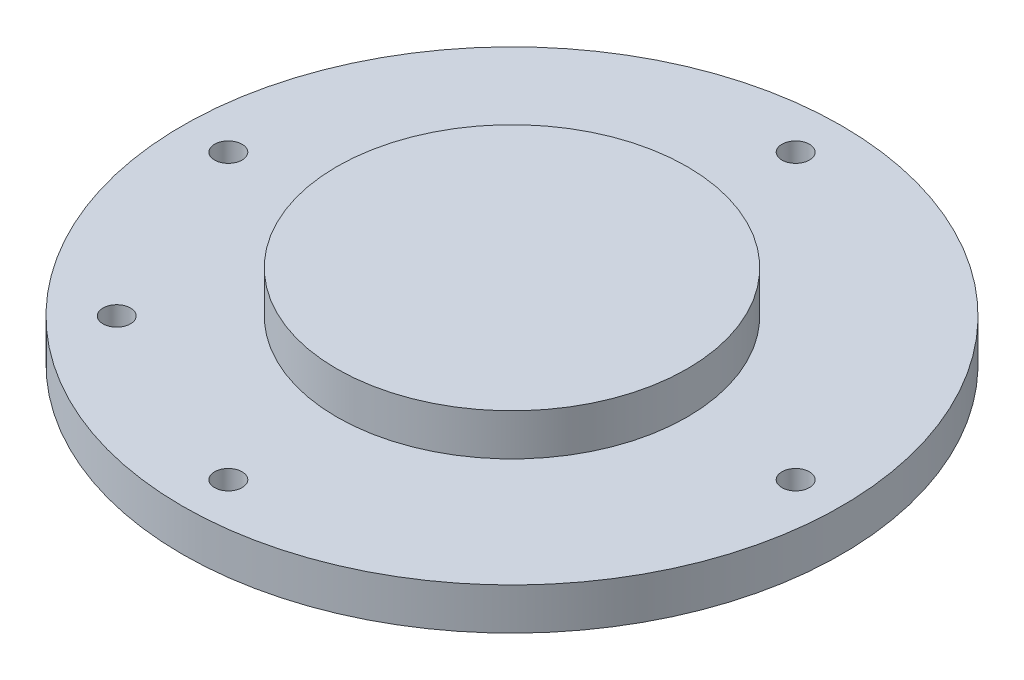
ISO-10303-21;
HEADER;
FILE_DESCRIPTION(('STEP AP214'),'2;1');
FILE_NAME('part.step','',(''),(''),'','','');
FILE_SCHEMA(('AUTOMOTIVE_DESIGN { 1 0 10303 214 1 1 1 1 }'));
ENDSEC;
DATA;
#1=APPLICATION_CONTEXT('core data for automotive mechanical design processes');
#2=APPLICATION_PROTOCOL_DEFINITION('international standard','automotive_design',2000,#1);
#3=PRODUCT_CONTEXT('',#1,'mechanical');
#4=PRODUCT('Part','Part','',(#3));
#5=PRODUCT_RELATED_PRODUCT_CATEGORY('part','',(#4));
#6=PRODUCT_DEFINITION_FORMATION('','',#4);
#7=PRODUCT_DEFINITION_CONTEXT('part definition',#1,'design');
#8=PRODUCT_DEFINITION('design','',#6,#7);
#9=PRODUCT_DEFINITION_SHAPE('','',#8);
#10=(LENGTH_UNIT() NAMED_UNIT(*) SI_UNIT(.MILLI.,.METRE.));
#11=(NAMED_UNIT(*) PLANE_ANGLE_UNIT() SI_UNIT($,.RADIAN.));
#12=(NAMED_UNIT(*) SI_UNIT($,.STERADIAN.) SOLID_ANGLE_UNIT());
#13=UNCERTAINTY_MEASURE_WITH_UNIT(LENGTH_MEASURE(1.E-05),#10,'distance_accuracy_value','');
#14=(GEOMETRIC_REPRESENTATION_CONTEXT(3) GLOBAL_UNCERTAINTY_ASSIGNED_CONTEXT((#13)) GLOBAL_UNIT_ASSIGNED_CONTEXT((#10,
#11,#12)) REPRESENTATION_CONTEXT('',''));
#15=CARTESIAN_POINT('',(0.,0.,0.));
#16=DIRECTION('',(0.,0.,1.));
#17=DIRECTION('',(1.,0.,0.));
#18=AXIS2_PLACEMENT_3D('',#15,#16,#17);
#19=CARTESIAN_POINT('',(0.,0.,0.));
#20=DIRECTION('',(0.,-1.,0.));
#21=DIRECTION('',(0.,0.,-1.));
#22=AXIS2_PLACEMENT_3D('',#19,#20,#21);
#23=PLANE('',#22);
#24=CARTESIAN_POINT('',(0.,0.,0.));
#25=DIRECTION('',(0.,-1.,0.));
#26=DIRECTION('',(0.,0.,-1.));
#27=AXIS2_PLACEMENT_3D('',#24,#25,#26);
#28=CIRCLE('',#27,22.5);
#29=CARTESIAN_POINT('',(0.,0.,-22.5));
#30=VERTEX_POINT('',#29);
#31=EDGE_CURVE('E90',#30,#30,#28,.T.);
#32=ORIENTED_EDGE('',*,*,#31,.F.);
#33=EDGE_LOOP('',(#32));
#34=FACE_BOUND('',#33,.T.);
#35=CARTESIAN_POINT('',(0.,0.,0.));
#36=DIRECTION('',(0.,-1.,0.));
#37=DIRECTION('',(0.,0.,-1.));
#38=AXIS2_PLACEMENT_3D('',#35,#36,#37);
#39=CIRCLE('',#38,25.5);
#40=CARTESIAN_POINT('',(0.,0.,-25.5));
#41=VERTEX_POINT('',#40);
#42=EDGE_CURVE('E84',#41,#41,#39,.T.);
#43=ORIENTED_EDGE('',*,*,#42,.T.);
#44=EDGE_LOOP('',(#43));
#45=FACE_BOUND('',#44,.T.);
#46=ADVANCED_FACE('F45',(#34,#45),#23,.T.);
#47=CARTESIAN_POINT('',(0.,2.45,0.));
#48=DIRECTION('',(0.,-1.,0.));
#49=DIRECTION('',(0.,0.,-1.));
#50=AXIS2_PLACEMENT_3D('',#47,#48,#49);
#51=CYLINDRICAL_SURFACE('',#50,28.);
#52=CARTESIAN_POINT('',(0.,2.45,0.));
#53=DIRECTION('',(0.,-1.,0.));
#54=DIRECTION('',(0.,0.,-1.));
#55=AXIS2_PLACEMENT_3D('',#52,#53,#54);
#56=CIRCLE('',#55,28.);
#57=CARTESIAN_POINT('',(0.,2.45,-28.));
#58=VERTEX_POINT('',#57);
#59=EDGE_CURVE('E76',#58,#58,#56,.T.);
#60=ORIENTED_EDGE('',*,*,#59,.F.);
#61=EDGE_LOOP('',(#60));
#62=FACE_BOUND('',#61,.T.);
#63=CARTESIAN_POINT('',(0.,0.,0.));
#64=DIRECTION('',(0.,-1.,0.));
#65=DIRECTION('',(0.,0.,-1.));
#66=AXIS2_PLACEMENT_3D('',#63,#64,#65);
#67=CIRCLE('',#66,28.);
#68=CARTESIAN_POINT('',(0.,0.,-28.));
#69=VERTEX_POINT('',#68);
#70=EDGE_CURVE('E77',#69,#69,#67,.T.);
#71=ORIENTED_EDGE('',*,*,#70,.T.);
#72=EDGE_LOOP('',(#71));
#73=FACE_BOUND('',#72,.T.);
#74=ADVANCED_FACE('F166',(#62,#73),#51,.F.);
#75=CARTESIAN_POINT('',(0.,2.45,0.));
#76=DIRECTION('',(0.,-1.,0.));
#77=DIRECTION('',(0.,0.,-1.));
#78=AXIS2_PLACEMENT_3D('',#75,#76,#77);
#79=PLANE('',#78);
#80=CARTESIAN_POINT('',(0.,2.45,0.));
#81=DIRECTION('',(0.,-1.,0.));
#82=DIRECTION('',(0.,0.,-1.));
#83=AXIS2_PLACEMENT_3D('',#80,#81,#82);
#84=CIRCLE('',#83,25.5);
#85=CARTESIAN_POINT('',(0.,2.45,-25.5));
#86=VERTEX_POINT('',#85);
#87=EDGE_CURVE('E80',#86,#86,#84,.T.);
#88=ORIENTED_EDGE('',*,*,#87,.F.);
#89=EDGE_LOOP('',(#88));
#90=FACE_BOUND('',#89,.T.);
#91=ORIENTED_EDGE('',*,*,#59,.T.);
#92=EDGE_LOOP('',(#91));
#93=FACE_BOUND('',#92,.T.);
#94=ADVANCED_FACE('F171',(#90,#93),#79,.T.);
#95=CARTESIAN_POINT('',(0.,2.45,0.));
#96=DIRECTION('',(0.,-1.,0.));
#97=DIRECTION('',(0.,0.,-1.));
#98=AXIS2_PLACEMENT_3D('',#95,#96,#97);
#99=CYLINDRICAL_SURFACE('',#98,25.5);
#100=ORIENTED_EDGE('',*,*,#87,.T.);
#101=EDGE_LOOP('',(#100));
#102=FACE_BOUND('',#101,.T.);
#103=ORIENTED_EDGE('',*,*,#42,.F.);
#104=EDGE_LOOP('',(#103));
#105=FACE_BOUND('',#104,.T.);
#106=ADVANCED_FACE('F208',(#102,#105),#99,.T.);
#107=CARTESIAN_POINT('',(0.,9.99999999999998,0.));
#108=DIRECTION('',(0.,1.,0.));
#109=DIRECTION('',(0.,0.,1.));
#110=AXIS2_PLACEMENT_3D('',#107,#108,#109);
#111=PLANE('',#110);
#112=CARTESIAN_POINT('',(0.,9.99999999999999,0.));
#113=DIRECTION('',(0.,-1.,0.));
#114=DIRECTION('',(0.,0.,-1.));
#115=AXIS2_PLACEMENT_3D('',#112,#113,#114);
#116=CIRCLE('',#115,21.);
#117=CARTESIAN_POINT('',(0.,9.99999999999999,-21.));
#118=VERTEX_POINT('',#117);
#119=EDGE_CURVE('E52',#118,#118,#116,.T.);
#120=ORIENTED_EDGE('',*,*,#119,.F.);
#121=EDGE_LOOP('',(#120));
#122=FACE_BOUND('',#121,.T.);
#123=ADVANCED_FACE('F211',(#122),#111,.T.);
#124=CARTESIAN_POINT('',(0.,0.,0.));
#125=DIRECTION('',(0.,-1.,0.));
#126=DIRECTION('',(0.,0.,-1.));
#127=AXIS2_PLACEMENT_3D('',#124,#125,#126);
#128=CYLINDRICAL_SURFACE('',#127,21.);
#129=ORIENTED_EDGE('',*,*,#119,.T.);
#130=EDGE_LOOP('',(#129));
#131=FACE_BOUND('',#130,.T.);
#132=CARTESIAN_POINT('',(0.,4.99999999999999,0.));
#133=DIRECTION('',(0.,-1.,0.));
#134=DIRECTION('',(0.,0.,-1.));
#135=AXIS2_PLACEMENT_3D('',#132,#133,#134);
#136=CIRCLE('',#135,21.);
#137=CARTESIAN_POINT('',(0.,4.99999999999999,-21.));
#138=VERTEX_POINT('',#137);
#139=EDGE_CURVE('E57',#138,#138,#136,.T.);
#140=ORIENTED_EDGE('',*,*,#139,.F.);
#141=EDGE_LOOP('',(#140));
#142=FACE_BOUND('',#141,.T.);
#143=ADVANCED_FACE('F162',(#131,#142),#128,.T.);
#144=CARTESIAN_POINT('',(0.,5.,0.));
#145=DIRECTION('',(0.,1.,0.));
#146=DIRECTION('',(0.,0.,1.));
#147=AXIS2_PLACEMENT_3D('',#144,#145,#146);
#148=PLANE('',#147);
#149=CARTESIAN_POINT('',(-23.6880771697493,5.,23.6880771697494));
#150=DIRECTION('',(0.,1.,0.));
#151=DIRECTION('',(0.,0.,1.));
#152=AXIS2_PLACEMENT_3D('',#149,#150,#151);
#153=CIRCLE('',#152,1.65);
#154=CARTESIAN_POINT('',(-23.6880771697493,5.,25.3380771697494));
#155=VERTEX_POINT('',#154);
#156=EDGE_CURVE('E125',#155,#155,#153,.T.);
#157=ORIENTED_EDGE('',*,*,#156,.F.);
#158=EDGE_LOOP('',(#157));
#159=FACE_BOUND('',#158,.T.);
#160=CARTESIAN_POINT('',(34.,5.,3.56131096562E-13));
#161=DIRECTION('',(0.,1.,0.));
#162=DIRECTION('',(0.,0.,1.));
#163=AXIS2_PLACEMENT_3D('',#160,#161,#162);
#164=CIRCLE('',#163,1.65);
#165=CARTESIAN_POINT('',(34.,5.,1.65000000000035));
#166=VERTEX_POINT('',#165);
#167=EDGE_CURVE('E119',#166,#166,#164,.T.);
#168=ORIENTED_EDGE('',*,*,#167,.F.);
#169=EDGE_LOOP('',(#168));
#170=FACE_BOUND('',#169,.T.);
#171=CARTESIAN_POINT('',(0.,5.,-34.));
#172=DIRECTION('',(0.,1.,0.));
#173=DIRECTION('',(0.,0.,1.));
#174=AXIS2_PLACEMENT_3D('',#171,#172,#173);
#175=CIRCLE('',#174,1.65);
#176=CARTESIAN_POINT('',(0.,5.,-32.35));
#177=VERTEX_POINT('',#176);
#178=EDGE_CURVE('E113',#177,#177,#175,.T.);
#179=ORIENTED_EDGE('',*,*,#178,.F.);
#180=EDGE_LOOP('',(#179));
#181=FACE_BOUND('',#180,.T.);
#182=CARTESIAN_POINT('',(-34.,5.,-1.18710365520667E-13));
#183=DIRECTION('',(0.,1.,0.));
#184=DIRECTION('',(0.,0.,1.));
#185=AXIS2_PLACEMENT_3D('',#182,#183,#184);
#186=CIRCLE('',#185,1.65);
#187=CARTESIAN_POINT('',(-34.,5.,1.64999999999988));
#188=VERTEX_POINT('',#187);
#189=EDGE_CURVE('E107',#188,#188,#186,.T.);
#190=ORIENTED_EDGE('',*,*,#189,.F.);
#191=EDGE_LOOP('',(#190));
#192=FACE_BOUND('',#191,.T.);
#193=CARTESIAN_POINT('',(0.,5.,34.));
#194=DIRECTION('',(0.,1.,0.));
#195=DIRECTION('',(0.,0.,1.));
#196=AXIS2_PLACEMENT_3D('',#193,#194,#195);
#197=CIRCLE('',#196,1.65);
#198=CARTESIAN_POINT('',(0.,5.,35.65));
#199=VERTEX_POINT('',#198);
#200=EDGE_CURVE('E99',#199,#199,#197,.T.);
#201=ORIENTED_EDGE('',*,*,#200,.F.);
#202=EDGE_LOOP('',(#201));
#203=FACE_BOUND('',#202,.T.);
#204=ORIENTED_EDGE('',*,*,#139,.T.);
#205=EDGE_LOOP('',(#204));
#206=FACE_BOUND('',#205,.T.);
#207=CARTESIAN_POINT('',(0.,5.00000000000001,0.));
#208=DIRECTION('',(0.,-1.,0.));
#209=DIRECTION('',(0.,0.,-1.));
#210=AXIS2_PLACEMENT_3D('',#207,#208,#209);
#211=CIRCLE('',#210,39.5);
#212=CARTESIAN_POINT('',(0.,5.00000000000001,-39.5));
#213=VERTEX_POINT('',#212);
#214=EDGE_CURVE('E63',#213,#213,#211,.T.);
#215=ORIENTED_EDGE('',*,*,#214,.F.);
#216=EDGE_LOOP('',(#215));
#217=FACE_BOUND('',#216,.T.);
#218=ADVANCED_FACE('F154',(#159,#170,#181,#192,#203,#206,#217),#148,.T.);
#219=CARTESIAN_POINT('',(0.,0.,0.));
#220=DIRECTION('',(0.,-1.,0.));
#221=DIRECTION('',(0.,0.,-1.));
#222=AXIS2_PLACEMENT_3D('',#219,#220,#221);
#223=CYLINDRICAL_SURFACE('',#222,39.5);
#224=ORIENTED_EDGE('',*,*,#214,.T.);
#225=EDGE_LOOP('',(#224));
#226=FACE_BOUND('',#225,.T.);
#227=CARTESIAN_POINT('',(0.,0.,0.));
#228=DIRECTION('',(0.,-1.,0.));
#229=DIRECTION('',(0.,0.,-1.));
#230=AXIS2_PLACEMENT_3D('',#227,#228,#229);
#231=CIRCLE('',#230,39.5);
#232=CARTESIAN_POINT('',(0.,0.,-39.5));
#233=VERTEX_POINT('',#232);
#234=EDGE_CURVE('E69',#233,#233,#231,.T.);
#235=ORIENTED_EDGE('',*,*,#234,.F.);
#236=EDGE_LOOP('',(#235));
#237=FACE_BOUND('',#236,.T.);
#238=ADVANCED_FACE('F138',(#226,#237),#223,.T.);
#239=CARTESIAN_POINT('',(-23.6880771697493,0.,23.6880771697494));
#240=DIRECTION('',(0.,-1.,0.));
#241=DIRECTION('',(0.,0.,-1.));
#242=AXIS2_PLACEMENT_3D('',#239,#240,#241);
#243=CIRCLE('',#242,1.65);
#244=CARTESIAN_POINT('',(-23.6880771697493,0.,22.0380771697494));
#245=VERTEX_POINT('',#244);
#246=EDGE_CURVE('E128',#245,#245,#243,.T.);
#247=ORIENTED_EDGE('',*,*,#246,.F.);
#248=EDGE_LOOP('',(#247));
#249=FACE_BOUND('',#248,.T.);
#250=CARTESIAN_POINT('',(34.,0.,3.56131096562E-13));
#251=DIRECTION('',(0.,-1.,0.));
#252=DIRECTION('',(0.,0.,-1.));
#253=AXIS2_PLACEMENT_3D('',#250,#251,#252);
#254=CIRCLE('',#253,1.65);
#255=CARTESIAN_POINT('',(34.,0.,-1.64999999999964));
#256=VERTEX_POINT('',#255);
#257=EDGE_CURVE('E122',#256,#256,#254,.T.);
#258=ORIENTED_EDGE('',*,*,#257,.F.);
#259=EDGE_LOOP('',(#258));
#260=FACE_BOUND('',#259,.T.);
#261=CARTESIAN_POINT('',(0.,0.,-34.));
#262=DIRECTION('',(0.,-1.,0.));
#263=DIRECTION('',(0.,0.,-1.));
#264=AXIS2_PLACEMENT_3D('',#261,#262,#263);
#265=CIRCLE('',#264,1.65);
#266=CARTESIAN_POINT('',(0.,0.,-35.65));
#267=VERTEX_POINT('',#266);
#268=EDGE_CURVE('E116',#267,#267,#265,.T.);
#269=ORIENTED_EDGE('',*,*,#268,.F.);
#270=EDGE_LOOP('',(#269));
#271=FACE_BOUND('',#270,.T.);
#272=CARTESIAN_POINT('',(-34.,0.,-1.18710365520667E-13));
#273=DIRECTION('',(0.,-1.,0.));
#274=DIRECTION('',(0.,0.,-1.));
#275=AXIS2_PLACEMENT_3D('',#272,#273,#274);
#276=CIRCLE('',#275,1.65);
#277=CARTESIAN_POINT('',(-34.,0.,-1.65000000000012));
#278=VERTEX_POINT('',#277);
#279=EDGE_CURVE('E110',#278,#278,#276,.T.);
#280=ORIENTED_EDGE('',*,*,#279,.F.);
#281=EDGE_LOOP('',(#280));
#282=FACE_BOUND('',#281,.T.);
#283=CARTESIAN_POINT('',(0.,0.,34.));
#284=DIRECTION('',(0.,-1.,0.));
#285=DIRECTION('',(0.,0.,-1.));
#286=AXIS2_PLACEMENT_3D('',#283,#284,#285);
#287=CIRCLE('',#286,1.65);
#288=CARTESIAN_POINT('',(0.,0.,32.35));
#289=VERTEX_POINT('',#288);
#290=EDGE_CURVE('E104',#289,#289,#287,.T.);
#291=ORIENTED_EDGE('',*,*,#290,.F.);
#292=EDGE_LOOP('',(#291));
#293=FACE_BOUND('',#292,.T.);
#294=ORIENTED_EDGE('',*,*,#70,.F.);
#295=EDGE_LOOP('',(#294));
#296=FACE_BOUND('',#295,.T.);
#297=ORIENTED_EDGE('',*,*,#234,.T.);
#298=EDGE_LOOP('',(#297));
#299=FACE_BOUND('',#298,.T.);
#300=ADVANCED_FACE('F134',(#249,#260,#271,#282,#293,#296,#299),#23,.T.);
#301=CARTESIAN_POINT('',(0.,1.68,0.));
#302=DIRECTION('',(0.,-1.,0.));
#303=DIRECTION('',(0.,0.,-1.));
#304=AXIS2_PLACEMENT_3D('',#301,#302,#303);
#305=CYLINDRICAL_SURFACE('',#304,22.5);
#306=CARTESIAN_POINT('',(0.,1.68,0.));
#307=DIRECTION('',(0.,-1.,0.));
#308=DIRECTION('',(0.,0.,-1.));
#309=AXIS2_PLACEMENT_3D('',#306,#307,#308);
#310=CIRCLE('',#309,22.5);
#311=CARTESIAN_POINT('',(0.,1.68,-22.5));
#312=VERTEX_POINT('',#311);
#313=EDGE_CURVE('E87',#312,#312,#310,.T.);
#314=ORIENTED_EDGE('',*,*,#313,.F.);
#315=EDGE_LOOP('',(#314));
#316=FACE_BOUND('',#315,.T.);
#317=ORIENTED_EDGE('',*,*,#31,.T.);
#318=EDGE_LOOP('',(#317));
#319=FACE_BOUND('',#318,.T.);
#320=ADVANCED_FACE('F137',(#316,#319),#305,.F.);
#321=CARTESIAN_POINT('',(0.,1.68,0.));
#322=DIRECTION('',(0.,-1.,0.));
#323=DIRECTION('',(0.,0.,-1.));
#324=AXIS2_PLACEMENT_3D('',#321,#322,#323);
#325=PLANE('',#324);
#326=CARTESIAN_POINT('',(0.,1.68,0.));
#327=DIRECTION('',(0.,-1.,0.));
#328=DIRECTION('',(0.,0.,-1.));
#329=AXIS2_PLACEMENT_3D('',#326,#327,#328);
#330=CIRCLE('',#329,19.5);
#331=CARTESIAN_POINT('',(0.,1.68,-19.5));
#332=VERTEX_POINT('',#331);
#333=EDGE_CURVE('E93',#332,#332,#330,.T.);
#334=ORIENTED_EDGE('',*,*,#333,.F.);
#335=EDGE_LOOP('',(#334));
#336=FACE_BOUND('',#335,.T.);
#337=ORIENTED_EDGE('',*,*,#313,.T.);
#338=EDGE_LOOP('',(#337));
#339=FACE_BOUND('',#338,.T.);
#340=ADVANCED_FACE('F195',(#336,#339),#325,.T.);
#341=CARTESIAN_POINT('',(0.,1.68,0.));
#342=DIRECTION('',(0.,-1.,0.));
#343=DIRECTION('',(0.,0.,-1.));
#344=AXIS2_PLACEMENT_3D('',#341,#342,#343);
#345=CYLINDRICAL_SURFACE('',#344,19.5);
#346=ORIENTED_EDGE('',*,*,#333,.T.);
#347=EDGE_LOOP('',(#346));
#348=FACE_BOUND('',#347,.T.);
#349=CARTESIAN_POINT('',(0.,0.,0.));
#350=DIRECTION('',(0.,-1.,0.));
#351=DIRECTION('',(0.,0.,-1.));
#352=AXIS2_PLACEMENT_3D('',#349,#350,#351);
#353=CIRCLE('',#352,19.5);
#354=CARTESIAN_POINT('',(0.,0.,-19.5));
#355=VERTEX_POINT('',#354);
#356=EDGE_CURVE('E96',#355,#355,#353,.T.);
#357=ORIENTED_EDGE('',*,*,#356,.F.);
#358=EDGE_LOOP('',(#357));
#359=FACE_BOUND('',#358,.T.);
#360=ADVANCED_FACE('F193',(#348,#359),#345,.T.);
#361=CARTESIAN_POINT('',(0.,5.,0.));
#362=DIRECTION('',(0.,1.,0.));
#363=DIRECTION('',(0.,0.,1.));
#364=AXIS2_PLACEMENT_3D('',#361,#362,#363);
#365=PLANE('',#364);
#366=CARTESIAN_POINT('',(0.,5.,0.));
#367=DIRECTION('',(0.,-1.,0.));
#368=DIRECTION('',(0.,0.,-1.));
#369=AXIS2_PLACEMENT_3D('',#366,#367,#368);
#370=CIRCLE('',#369,16.);
#371=CARTESIAN_POINT('',(0.,5.,-16.));
#372=VERTEX_POINT('',#371);
#373=EDGE_CURVE('E11',#372,#372,#370,.T.);
#374=ORIENTED_EDGE('',*,*,#373,.T.);
#375=EDGE_LOOP('',(#374));
#376=FACE_BOUND('',#375,.T.);
#377=ADVANCED_FACE('F187',(#376),#365,.F.);
#378=CARTESIAN_POINT('',(0.,0.,0.));
#379=DIRECTION('',(0.,-1.,0.));
#380=DIRECTION('',(0.,0.,-1.));
#381=AXIS2_PLACEMENT_3D('',#378,#379,#380);
#382=CYLINDRICAL_SURFACE('',#381,16.);
#383=ORIENTED_EDGE('',*,*,#373,.F.);
#384=EDGE_LOOP('',(#383));
#385=FACE_BOUND('',#384,.T.);
#386=CARTESIAN_POINT('',(0.,0.,0.));
#387=DIRECTION('',(0.,-1.,0.));
#388=DIRECTION('',(0.,0.,-1.));
#389=AXIS2_PLACEMENT_3D('',#386,#387,#388);
#390=CIRCLE('',#389,16.);
#391=CARTESIAN_POINT('',(0.,0.,-16.));
#392=VERTEX_POINT('',#391);
#393=EDGE_CURVE('E73',#392,#392,#390,.T.);
#394=ORIENTED_EDGE('',*,*,#393,.T.);
#395=EDGE_LOOP('',(#394));
#396=FACE_BOUND('',#395,.T.);
#397=ADVANCED_FACE('F47',(#385,#396),#382,.F.);
#398=ORIENTED_EDGE('',*,*,#393,.F.);
#399=EDGE_LOOP('',(#398));
#400=FACE_BOUND('',#399,.T.);
#401=ORIENTED_EDGE('',*,*,#356,.T.);
#402=EDGE_LOOP('',(#401));
#403=FACE_BOUND('',#402,.T.);
#404=ADVANCED_FACE('F140',(#400,#403),#23,.T.);
#405=CARTESIAN_POINT('',(0.,0.,34.));
#406=DIRECTION('',(0.,-1.,0.));
#407=DIRECTION('',(0.,0.,-1.));
#408=AXIS2_PLACEMENT_3D('',#405,#406,#407);
#409=CYLINDRICAL_SURFACE('',#408,1.65);
#410=ORIENTED_EDGE('',*,*,#200,.T.);
#411=EDGE_LOOP('',(#410));
#412=FACE_BOUND('',#411,.T.);
#413=ORIENTED_EDGE('',*,*,#290,.T.);
#414=EDGE_LOOP('',(#413));
#415=FACE_BOUND('',#414,.T.);
#416=ADVANCED_FACE('F178',(#412,#415),#409,.F.);
#417=CARTESIAN_POINT('',(-34.,0.,-1.18710365520667E-13));
#418=DIRECTION('',(0.,-1.,0.));
#419=DIRECTION('',(0.,0.,-1.));
#420=AXIS2_PLACEMENT_3D('',#417,#418,#419);
#421=CYLINDRICAL_SURFACE('',#420,1.65);
#422=ORIENTED_EDGE('',*,*,#189,.T.);
#423=EDGE_LOOP('',(#422));
#424=FACE_BOUND('',#423,.T.);
#425=ORIENTED_EDGE('',*,*,#279,.T.);
#426=EDGE_LOOP('',(#425));
#427=FACE_BOUND('',#426,.T.);
#428=ADVANCED_FACE('F184',(#424,#427),#421,.F.);
#429=CARTESIAN_POINT('',(0.,0.,-34.));
#430=DIRECTION('',(0.,-1.,0.));
#431=DIRECTION('',(0.,0.,-1.));
#432=AXIS2_PLACEMENT_3D('',#429,#430,#431);
#433=CYLINDRICAL_SURFACE('',#432,1.65);
#434=ORIENTED_EDGE('',*,*,#178,.T.);
#435=EDGE_LOOP('',(#434));
#436=FACE_BOUND('',#435,.T.);
#437=ORIENTED_EDGE('',*,*,#268,.T.);
#438=EDGE_LOOP('',(#437));
#439=FACE_BOUND('',#438,.T.);
#440=ADVANCED_FACE('F279',(#436,#439),#433,.F.);
#441=CARTESIAN_POINT('',(34.,0.,3.56131096562E-13));
#442=DIRECTION('',(0.,-1.,0.));
#443=DIRECTION('',(0.,0.,-1.));
#444=AXIS2_PLACEMENT_3D('',#441,#442,#443);
#445=CYLINDRICAL_SURFACE('',#444,1.65);
#446=ORIENTED_EDGE('',*,*,#167,.T.);
#447=EDGE_LOOP('',(#446));
#448=FACE_BOUND('',#447,.T.);
#449=ORIENTED_EDGE('',*,*,#257,.T.);
#450=EDGE_LOOP('',(#449));
#451=FACE_BOUND('',#450,.T.);
#452=ADVANCED_FACE('F255',(#448,#451),#445,.F.);
#453=CARTESIAN_POINT('',(-23.6880771697493,0.,23.6880771697494));
#454=DIRECTION('',(0.,-1.,0.));
#455=DIRECTION('',(0.,0.,-1.));
#456=AXIS2_PLACEMENT_3D('',#453,#454,#455);
#457=CYLINDRICAL_SURFACE('',#456,1.65);
#458=ORIENTED_EDGE('',*,*,#156,.T.);
#459=EDGE_LOOP('',(#458));
#460=FACE_BOUND('',#459,.T.);
#461=ORIENTED_EDGE('',*,*,#246,.T.);
#462=EDGE_LOOP('',(#461));
#463=FACE_BOUND('',#462,.T.);
#464=ADVANCED_FACE('F132',(#460,#463),#457,.F.);
#465=CLOSED_SHELL('',(#46,#74,#94,#106,#123,#143,#218,#238,#300,#320,#340,#360,#377,#397,#404,
#416,#428,#440,#452,#464));
#466=MANIFOLD_SOLID_BREP('B2',#465);
#467=ADVANCED_BREP_SHAPE_REPRESENTATION('',(#18,#466),#14);
#468=SHAPE_DEFINITION_REPRESENTATION(#9,#467);
ENDSEC;
END-ISO-10303-21;
